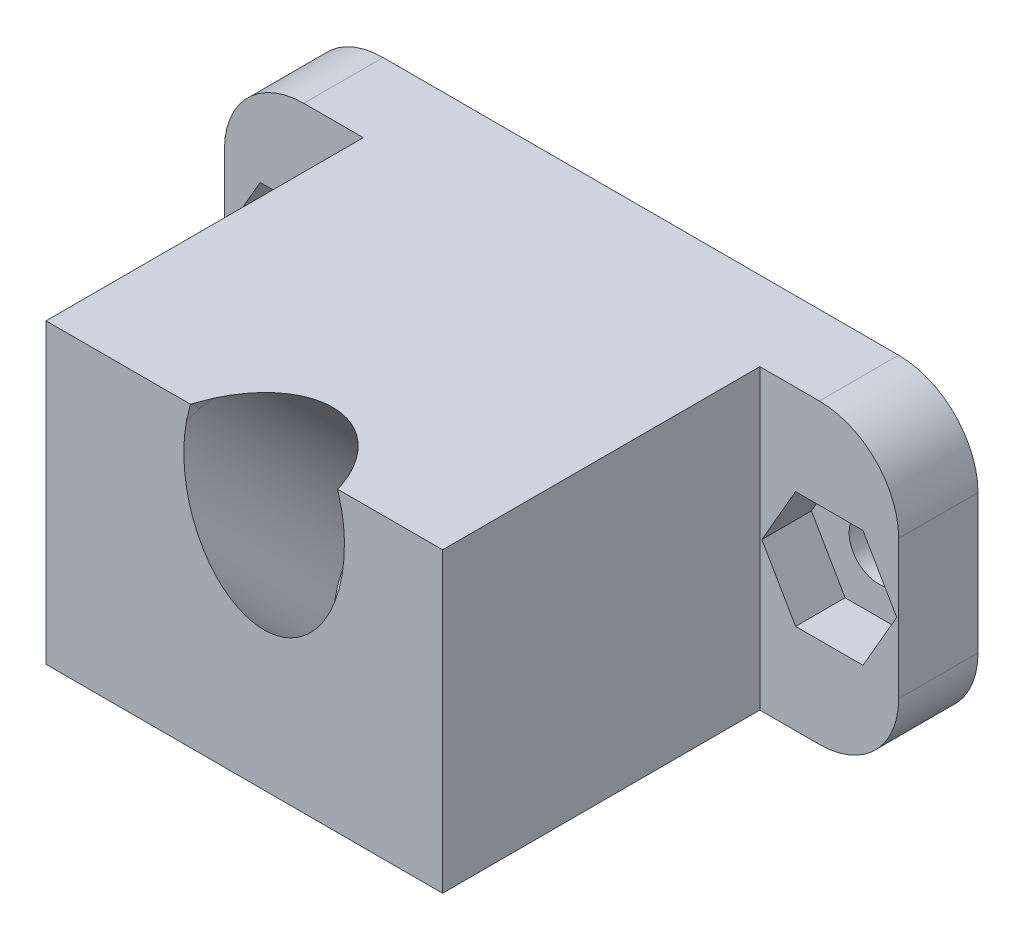
ISO-10303-21;
HEADER;
FILE_DESCRIPTION(('STEP AP214'),'2;1');
FILE_NAME('part.step','',(''),(''),'','','');
FILE_SCHEMA(('AUTOMOTIVE_DESIGN { 1 0 10303 214 1 1 1 1 }'));
ENDSEC;
DATA;
#1=APPLICATION_CONTEXT('core data for automotive mechanical design processes');
#2=APPLICATION_PROTOCOL_DEFINITION('international standard','automotive_design',2000,#1);
#3=PRODUCT_CONTEXT('',#1,'mechanical');
#4=PRODUCT('Part','Part','',(#3));
#5=PRODUCT_RELATED_PRODUCT_CATEGORY('part','',(#4));
#6=PRODUCT_DEFINITION_FORMATION('','',#4);
#7=PRODUCT_DEFINITION_CONTEXT('part definition',#1,'design');
#8=PRODUCT_DEFINITION('design','',#6,#7);
#9=PRODUCT_DEFINITION_SHAPE('','',#8);
#10=(LENGTH_UNIT() NAMED_UNIT(*) SI_UNIT(.MILLI.,.METRE.));
#11=(NAMED_UNIT(*) PLANE_ANGLE_UNIT() SI_UNIT($,.RADIAN.));
#12=(NAMED_UNIT(*) SI_UNIT($,.STERADIAN.) SOLID_ANGLE_UNIT());
#13=UNCERTAINTY_MEASURE_WITH_UNIT(LENGTH_MEASURE(1.E-05),#10,'distance_accuracy_value','');
#14=(GEOMETRIC_REPRESENTATION_CONTEXT(3) GLOBAL_UNCERTAINTY_ASSIGNED_CONTEXT((#13)) GLOBAL_UNIT_ASSIGNED_CONTEXT((#10,
#11,#12)) REPRESENTATION_CONTEXT('',''));
#15=CARTESIAN_POINT('',(0.,0.,0.));
#16=DIRECTION('',(0.,0.,1.));
#17=DIRECTION('',(1.,0.,0.));
#18=AXIS2_PLACEMENT_3D('',#15,#16,#17);
#19=CARTESIAN_POINT('',(0.999999999999999,5.9350288425444,20.7071067811867));
#20=DIRECTION('',(0.,0.707106781186539,0.707106781186556));
#21=DIRECTION('',(0.,-0.707106781186556,0.707106781186539));
#22=AXIS2_PLACEMENT_3D('',#19,#20,#21);
#23=PLANE('',#22);
#24=CARTESIAN_POINT('',(0.999999999999999,5.9350288425444,20.7071067811867));
#25=DIRECTION('',(0.,0.707106781186539,0.707106781186556));
#26=DIRECTION('',(0.,-0.707106781186556,0.707106781186539));
#27=AXIS2_PLACEMENT_3D('',#24,#25,#26);
#28=CIRCLE('',#27,4.05);
#29=CARTESIAN_POINT('',(-2.39178869516723,7.5,19.1421356237311));
#30=VERTEX_POINT('',#29);
#31=CARTESIAN_POINT('',(-2.70814757595359,7.08658030794869,19.5555553157825));
#32=VERTEX_POINT('',#31);
#33=EDGE_CURVE('E258',#30,#32,#28,.T.);
#34=ORIENTED_EDGE('',*,*,#33,.F.);
#35=DIRECTION('',(0.475894672597482,0.621902026284428,-0.621902026284412));
#36=VECTOR('',#35,1.);
#37=CARTESIAN_POINT('',(-2.39178869516723,7.5,19.1421356237311));
#38=LINE('',#37,#36);
#39=EDGE_CURVE('E532',#32,#30,#38,.T.);
#40=ORIENTED_EDGE('',*,*,#39,.F.);
#41=EDGE_LOOP('',(#34,#40));
#42=FACE_BOUND('',#41,.T.);
#43=ADVANCED_FACE('F35',(#42),#23,.F.);
#44=CARTESIAN_POINT('',(-2.92460189063802,6.64213562373112,20.));
#45=VERTEX_POINT('',#44);
#46=EDGE_CURVE('E257',#32,#45,#28,.T.);
#47=ORIENTED_EDGE('',*,*,#46,.F.);
#48=DIRECTION('',(0.32560949439134,0.668572530531368,-0.668572530531354));
#49=VECTOR('',#48,1.);
#50=CARTESIAN_POINT('',(-2.70814757595359,7.08658030794869,19.5555553157825));
#51=LINE('',#50,#49);
#52=EDGE_CURVE('E237',#45,#32,#51,.T.);
#53=ORIENTED_EDGE('',*,*,#52,.F.);
#54=EDGE_LOOP('',(#47,#53));
#55=FACE_BOUND('',#54,.T.);
#56=ADVANCED_FACE('F552',(#55),#23,.F.);
#57=CARTESIAN_POINT('',(4.6436733181703,7.18525777167175,19.4568778520594));
#58=VERTEX_POINT('',#57);
#59=CARTESIAN_POINT('',(4.39178869516723,7.5,19.1421356237311));
#60=VERTEX_POINT('',#59);
#61=EDGE_CURVE('E255',#58,#60,#28,.T.);
#62=ORIENTED_EDGE('',*,*,#61,.F.);
#63=DIRECTION('',(0.492500516136825,-0.615403624300744,0.615403624300727));
#64=VECTOR('',#63,1.);
#65=CARTESIAN_POINT('',(4.6436733181703,7.18525777167176,19.4568778520594));
#66=LINE('',#65,#64);
#67=EDGE_CURVE('E50',#60,#58,#66,.T.);
#68=ORIENTED_EDGE('',*,*,#67,.F.);
#69=EDGE_LOOP('',(#62,#68));
#70=FACE_BOUND('',#69,.T.);
#71=ADVANCED_FACE('F557',(#70),#23,.F.);
#72=CARTESIAN_POINT('',(-11.8,-2.94448637286709,4.));
#73=DIRECTION('',(-0.866025403784439,0.5,0.));
#74=DIRECTION('',(-0.5,-0.866025403784439,0.));
#75=AXIS2_PLACEMENT_3D('',#72,#73,#74);
#76=PLANE('',#75);
#77=DIRECTION('',(0.,0.,-1.));
#78=VECTOR('',#77,1.);
#79=CARTESIAN_POINT('',(-10.1,0.,4.));
#80=LINE('',#79,#78);
#81=CARTESIAN_POINT('',(-10.1,0.,4.));
#82=VERTEX_POINT('',#81);
#83=CARTESIAN_POINT('',(-10.1,0.,1.5));
#84=VERTEX_POINT('',#83);
#85=EDGE_CURVE('E403',#82,#84,#80,.T.);
#86=ORIENTED_EDGE('',*,*,#85,.T.);
#87=DIRECTION('',(-0.500000000000007,-0.866025403784435,0.));
#88=VECTOR('',#87,1.);
#89=CARTESIAN_POINT('',(-10.1,0.,1.5));
#90=LINE('',#89,#88);
#91=CARTESIAN_POINT('',(-11.8,-2.94448637286711,1.5));
#92=VERTEX_POINT('',#91);
#93=EDGE_CURVE('E306',#84,#92,#90,.T.);
#94=ORIENTED_EDGE('',*,*,#93,.T.);
#95=DIRECTION('',(0.,0.,-1.));
#96=VECTOR('',#95,1.);
#97=CARTESIAN_POINT('',(-11.8,-2.94448637286709,4.));
#98=LINE('',#97,#96);
#99=CARTESIAN_POINT('',(-11.8,-2.94448637286709,4.));
#100=VERTEX_POINT('',#99);
#101=EDGE_CURVE('E388',#100,#92,#98,.T.);
#102=ORIENTED_EDGE('',*,*,#101,.F.);
#103=DIRECTION('',(0.5,0.866025403784439,0.));
#104=VECTOR('',#103,1.);
#105=CARTESIAN_POINT('',(-11.8,-2.94448637286709,4.));
#106=LINE('',#105,#104);
#107=EDGE_CURVE('E373',#100,#82,#106,.T.);
#108=ORIENTED_EDGE('',*,*,#107,.T.);
#109=EDGE_LOOP('',(#86,#94,#102,#108));
#110=FACE_BOUND('',#109,.T.);
#111=ADVANCED_FACE('F569',(#110),#76,.T.);
#112=CARTESIAN_POINT('',(-10.1,0.,4.));
#113=DIRECTION('',(-0.866025403784438,-0.500000000000001,0.));
#114=DIRECTION('',(0.500000000000001,-0.866025403784438,0.));
#115=AXIS2_PLACEMENT_3D('',#112,#113,#114);
#116=PLANE('',#115);
#117=DIRECTION('',(0.,0.,-1.));
#118=VECTOR('',#117,1.);
#119=CARTESIAN_POINT('',(-11.8,2.94448637286709,4.));
#120=LINE('',#119,#118);
#121=CARTESIAN_POINT('',(-11.8,2.94448637286709,4.));
#122=VERTEX_POINT('',#121);
#123=CARTESIAN_POINT('',(-11.8,2.94448637286708,1.5));
#124=VERTEX_POINT('',#123);
#125=EDGE_CURVE('E400',#122,#124,#120,.T.);
#126=ORIENTED_EDGE('',*,*,#125,.T.);
#127=DIRECTION('',(0.499999999999995,-0.866025403784441,0.));
#128=VECTOR('',#127,1.);
#129=CARTESIAN_POINT('',(-11.8,2.94448637286708,1.5));
#130=LINE('',#129,#128);
#131=EDGE_CURVE('E303',#124,#84,#130,.T.);
#132=ORIENTED_EDGE('',*,*,#131,.T.);
#133=ORIENTED_EDGE('',*,*,#85,.F.);
#134=DIRECTION('',(-0.500000000000001,0.866025403784438,0.));
#135=VECTOR('',#134,1.);
#136=CARTESIAN_POINT('',(-10.1,0.,4.));
#137=LINE('',#136,#135);
#138=EDGE_CURVE('E377',#82,#122,#137,.T.);
#139=ORIENTED_EDGE('',*,*,#138,.T.);
#140=EDGE_LOOP('',(#126,#132,#133,#139));
#141=FACE_BOUND('',#140,.T.);
#142=ADVANCED_FACE('F573',(#141),#116,.T.);
#143=CARTESIAN_POINT('',(-11.8,2.94448637286709,4.));
#144=DIRECTION('',(0.,-1.,0.));
#145=DIRECTION('',(1.,0.,0.));
#146=AXIS2_PLACEMENT_3D('',#143,#144,#145);
#147=PLANE('',#146);
#148=DIRECTION('',(0.,0.,-1.));
#149=VECTOR('',#148,1.);
#150=CARTESIAN_POINT('',(-15.2,2.94448637286709,4.));
#151=LINE('',#150,#149);
#152=CARTESIAN_POINT('',(-15.2,2.94448637286709,4.));
#153=VERTEX_POINT('',#152);
#154=CARTESIAN_POINT('',(-15.2,2.94448637286709,1.5));
#155=VERTEX_POINT('',#154);
#156=EDGE_CURVE('E397',#153,#155,#151,.T.);
#157=ORIENTED_EDGE('',*,*,#156,.T.);
#158=DIRECTION('',(1.,0.,0.));
#159=VECTOR('',#158,1.);
#160=CARTESIAN_POINT('',(-15.2,2.94448637286709,1.5));
#161=LINE('',#160,#159);
#162=EDGE_CURVE('E300',#155,#124,#161,.T.);
#163=ORIENTED_EDGE('',*,*,#162,.T.);
#164=ORIENTED_EDGE('',*,*,#125,.F.);
#165=DIRECTION('',(-1.,0.,0.));
#166=VECTOR('',#165,1.);
#167=CARTESIAN_POINT('',(-11.8,2.94448637286709,4.));
#168=LINE('',#167,#166);
#169=EDGE_CURVE('E379',#122,#153,#168,.T.);
#170=ORIENTED_EDGE('',*,*,#169,.T.);
#171=EDGE_LOOP('',(#157,#163,#164,#170));
#172=FACE_BOUND('',#171,.T.);
#173=ADVANCED_FACE('F579',(#172),#147,.T.);
#174=CARTESIAN_POINT('',(-15.2,2.94448637286709,4.));
#175=DIRECTION('',(0.866025403784439,-0.5,0.));
#176=DIRECTION('',(0.5,0.866025403784439,0.));
#177=AXIS2_PLACEMENT_3D('',#174,#175,#176);
#178=PLANE('',#177);
#179=DIRECTION('',(0.,0.,-1.));
#180=VECTOR('',#179,1.);
#181=CARTESIAN_POINT('',(-16.9,0.,4.));
#182=LINE('',#181,#180);
#183=CARTESIAN_POINT('',(-16.9,0.,4.));
#184=VERTEX_POINT('',#183);
#185=CARTESIAN_POINT('',(-16.9,0.,1.5));
#186=VERTEX_POINT('',#185);
#187=EDGE_CURVE('E394',#184,#186,#182,.T.);
#188=ORIENTED_EDGE('',*,*,#187,.T.);
#189=DIRECTION('',(0.500000000000001,0.866025403784438,0.));
#190=VECTOR('',#189,1.);
#191=CARTESIAN_POINT('',(-16.9,0.,1.5));
#192=LINE('',#191,#190);
#193=EDGE_CURVE('E297',#186,#155,#192,.T.);
#194=ORIENTED_EDGE('',*,*,#193,.T.);
#195=ORIENTED_EDGE('',*,*,#156,.F.);
#196=DIRECTION('',(-0.5,-0.866025403784439,0.));
#197=VECTOR('',#196,1.);
#198=CARTESIAN_POINT('',(-15.2,2.94448637286709,4.));
#199=LINE('',#198,#197);
#200=EDGE_CURVE('E381',#153,#184,#199,.T.);
#201=ORIENTED_EDGE('',*,*,#200,.T.);
#202=EDGE_LOOP('',(#188,#194,#195,#201));
#203=FACE_BOUND('',#202,.T.);
#204=ADVANCED_FACE('F796',(#203),#178,.T.);
#205=CARTESIAN_POINT('',(-16.9,0.,4.));
#206=DIRECTION('',(0.866025403784439,0.5,0.));
#207=DIRECTION('',(-0.5,0.866025403784439,0.));
#208=AXIS2_PLACEMENT_3D('',#205,#206,#207);
#209=PLANE('',#208);
#210=DIRECTION('',(0.,0.,-1.));
#211=VECTOR('',#210,1.);
#212=CARTESIAN_POINT('',(-15.2,-2.94448637286709,4.));
#213=LINE('',#212,#211);
#214=CARTESIAN_POINT('',(-15.2,-2.94448637286709,4.));
#215=VERTEX_POINT('',#214);
#216=CARTESIAN_POINT('',(-15.2,-2.94448637286709,1.5));
#217=VERTEX_POINT('',#216);
#218=EDGE_CURVE('E391',#215,#217,#213,.T.);
#219=ORIENTED_EDGE('',*,*,#218,.T.);
#220=DIRECTION('',(-0.499999999999995,0.866025403784441,0.));
#221=VECTOR('',#220,1.);
#222=CARTESIAN_POINT('',(-15.2,-2.94448637286707,1.5));
#223=LINE('',#222,#221);
#224=EDGE_CURVE('E289',#217,#186,#223,.T.);
#225=ORIENTED_EDGE('',*,*,#224,.T.);
#226=ORIENTED_EDGE('',*,*,#187,.F.);
#227=DIRECTION('',(0.5,-0.866025403784439,0.));
#228=VECTOR('',#227,1.);
#229=CARTESIAN_POINT('',(-16.9,0.,4.));
#230=LINE('',#229,#228);
#231=EDGE_CURVE('E383',#184,#215,#230,.T.);
#232=ORIENTED_EDGE('',*,*,#231,.T.);
#233=EDGE_LOOP('',(#219,#225,#226,#232));
#234=FACE_BOUND('',#233,.T.);
#235=ADVANCED_FACE('F804',(#234),#209,.T.);
#236=CARTESIAN_POINT('',(-15.2,-2.94448637286709,4.));
#237=DIRECTION('',(0.,1.,0.));
#238=DIRECTION('',(-1.,0.,0.));
#239=AXIS2_PLACEMENT_3D('',#236,#237,#238);
#240=PLANE('',#239);
#241=ORIENTED_EDGE('',*,*,#101,.T.);
#242=DIRECTION('',(-1.,0.,0.));
#243=VECTOR('',#242,1.);
#244=CARTESIAN_POINT('',(-11.8,-2.94448637286711,1.5));
#245=LINE('',#244,#243);
#246=EDGE_CURVE('E309',#92,#217,#245,.T.);
#247=ORIENTED_EDGE('',*,*,#246,.T.);
#248=ORIENTED_EDGE('',*,*,#218,.F.);
#249=DIRECTION('',(1.,0.,0.));
#250=VECTOR('',#249,1.);
#251=CARTESIAN_POINT('',(-15.2,-2.94448637286709,4.));
#252=LINE('',#251,#250);
#253=EDGE_CURVE('E386',#215,#100,#252,.T.);
#254=ORIENTED_EDGE('',*,*,#253,.T.);
#255=EDGE_LOOP('',(#241,#247,#248,#254));
#256=FACE_BOUND('',#255,.T.);
#257=ADVANCED_FACE('F813',(#256),#240,.T.);
#258=CARTESIAN_POINT('',(15.2,-2.94448637286709,4.));
#259=DIRECTION('',(-0.866025403784439,0.5,0.));
#260=DIRECTION('',(-0.5,-0.866025403784439,0.));
#261=AXIS2_PLACEMENT_3D('',#258,#259,#260);
#262=PLANE('',#261);
#263=DIRECTION('',(0.,0.,-1.));
#264=VECTOR('',#263,1.);
#265=CARTESIAN_POINT('',(16.9,0.,4.));
#266=LINE('',#265,#264);
#267=CARTESIAN_POINT('',(16.9,0.,4.));
#268=VERTEX_POINT('',#267);
#269=CARTESIAN_POINT('',(16.9,0.,1.5));
#270=VERTEX_POINT('',#269);
#271=EDGE_CURVE('E358',#268,#270,#266,.T.);
#272=ORIENTED_EDGE('',*,*,#271,.T.);
#273=DIRECTION('',(-0.500000000000006,-0.866025403784435,0.));
#274=VECTOR('',#273,1.);
#275=CARTESIAN_POINT('',(16.9,0.,1.5));
#276=LINE('',#275,#274);
#277=CARTESIAN_POINT('',(15.2,-2.94448637286711,1.5));
#278=VERTEX_POINT('',#277);
#279=EDGE_CURVE('E324',#270,#278,#276,.T.);
#280=ORIENTED_EDGE('',*,*,#279,.T.);
#281=DIRECTION('',(0.,0.,-1.));
#282=VECTOR('',#281,1.);
#283=CARTESIAN_POINT('',(15.2,-2.94448637286709,4.));
#284=LINE('',#283,#282);
#285=CARTESIAN_POINT('',(15.2,-2.94448637286709,4.));
#286=VERTEX_POINT('',#285);
#287=EDGE_CURVE('E343',#286,#278,#284,.T.);
#288=ORIENTED_EDGE('',*,*,#287,.F.);
#289=DIRECTION('',(0.5,0.866025403784439,0.));
#290=VECTOR('',#289,1.);
#291=CARTESIAN_POINT('',(15.2,-2.94448637286709,4.));
#292=LINE('',#291,#290);
#293=EDGE_CURVE('E330',#286,#268,#292,.T.);
#294=ORIENTED_EDGE('',*,*,#293,.T.);
#295=EDGE_LOOP('',(#272,#280,#288,#294));
#296=FACE_BOUND('',#295,.T.);
#297=ADVANCED_FACE('F822',(#296),#262,.T.);
#298=CARTESIAN_POINT('',(16.9,0.,4.));
#299=DIRECTION('',(-0.866025403784438,-0.500000000000001,0.));
#300=DIRECTION('',(0.500000000000001,-0.866025403784438,0.));
#301=AXIS2_PLACEMENT_3D('',#298,#299,#300);
#302=PLANE('',#301);
#303=DIRECTION('',(0.,0.,-1.));
#304=VECTOR('',#303,1.);
#305=CARTESIAN_POINT('',(15.2,2.94448637286709,4.));
#306=LINE('',#305,#304);
#307=CARTESIAN_POINT('',(15.2,2.94448637286709,4.));
#308=VERTEX_POINT('',#307);
#309=CARTESIAN_POINT('',(15.2,2.94448637286709,1.5));
#310=VERTEX_POINT('',#309);
#311=EDGE_CURVE('E355',#308,#310,#306,.T.);
#312=ORIENTED_EDGE('',*,*,#311,.T.);
#313=DIRECTION('',(0.499999999999996,-0.866025403784441,0.));
#314=VECTOR('',#313,1.);
#315=CARTESIAN_POINT('',(15.2,2.94448637286709,1.5));
#316=LINE('',#315,#314);
#317=EDGE_CURVE('E321',#310,#270,#316,.T.);
#318=ORIENTED_EDGE('',*,*,#317,.T.);
#319=ORIENTED_EDGE('',*,*,#271,.F.);
#320=DIRECTION('',(-0.500000000000001,0.866025403784438,0.));
#321=VECTOR('',#320,1.);
#322=CARTESIAN_POINT('',(16.9,0.,4.));
#323=LINE('',#322,#321);
#324=EDGE_CURVE('E332',#268,#308,#323,.T.);
#325=ORIENTED_EDGE('',*,*,#324,.T.);
#326=EDGE_LOOP('',(#312,#318,#319,#325));
#327=FACE_BOUND('',#326,.T.);
#328=ADVANCED_FACE('F831',(#327),#302,.T.);
#329=CARTESIAN_POINT('',(15.2,2.94448637286709,4.));
#330=DIRECTION('',(0.,-1.,0.));
#331=DIRECTION('',(0.,0.,-1.));
#332=AXIS2_PLACEMENT_3D('',#329,#330,#331);
#333=PLANE('',#332);
#334=DIRECTION('',(0.,0.,-1.));
#335=VECTOR('',#334,1.);
#336=CARTESIAN_POINT('',(11.8,2.94448637286709,4.));
#337=LINE('',#336,#335);
#338=CARTESIAN_POINT('',(11.8,2.94448637286709,4.));
#339=VERTEX_POINT('',#338);
#340=CARTESIAN_POINT('',(11.8,2.9444863728671,1.5));
#341=VERTEX_POINT('',#340);
#342=EDGE_CURVE('E352',#339,#341,#337,.T.);
#343=ORIENTED_EDGE('',*,*,#342,.T.);
#344=DIRECTION('',(1.,0.,0.));
#345=VECTOR('',#344,1.);
#346=CARTESIAN_POINT('',(11.8,2.9444863728671,1.5));
#347=LINE('',#346,#345);
#348=EDGE_CURVE('E318',#341,#310,#347,.T.);
#349=ORIENTED_EDGE('',*,*,#348,.T.);
#350=ORIENTED_EDGE('',*,*,#311,.F.);
#351=DIRECTION('',(-1.,0.,0.));
#352=VECTOR('',#351,1.);
#353=CARTESIAN_POINT('',(15.2,2.94448637286709,4.));
#354=LINE('',#353,#352);
#355=EDGE_CURVE('E334',#308,#339,#354,.T.);
#356=ORIENTED_EDGE('',*,*,#355,.T.);
#357=EDGE_LOOP('',(#343,#349,#350,#356));
#358=FACE_BOUND('',#357,.T.);
#359=ADVANCED_FACE('F840',(#358),#333,.T.);
#360=CARTESIAN_POINT('',(11.8,2.94448637286709,4.));
#361=DIRECTION('',(0.866025403784439,-0.5,0.));
#362=DIRECTION('',(0.5,0.866025403784439,0.));
#363=AXIS2_PLACEMENT_3D('',#360,#361,#362);
#364=PLANE('',#363);
#365=DIRECTION('',(0.,0.,-1.));
#366=VECTOR('',#365,1.);
#367=CARTESIAN_POINT('',(10.1,0.,4.));
#368=LINE('',#367,#366);
#369=CARTESIAN_POINT('',(10.1,0.,4.));
#370=VERTEX_POINT('',#369);
#371=CARTESIAN_POINT('',(10.1,0.,1.5));
#372=VERTEX_POINT('',#371);
#373=EDGE_CURVE('E349',#370,#372,#368,.T.);
#374=ORIENTED_EDGE('',*,*,#373,.T.);
#375=DIRECTION('',(0.5,0.866025403784439,0.));
#376=VECTOR('',#375,1.);
#377=CARTESIAN_POINT('',(10.1,0.,1.5));
#378=LINE('',#377,#376);
#379=EDGE_CURVE('E315',#372,#341,#378,.T.);
#380=ORIENTED_EDGE('',*,*,#379,.T.);
#381=ORIENTED_EDGE('',*,*,#342,.F.);
#382=DIRECTION('',(-0.5,-0.866025403784439,0.));
#383=VECTOR('',#382,1.);
#384=CARTESIAN_POINT('',(11.8,2.94448637286709,4.));
#385=LINE('',#384,#383);
#386=EDGE_CURVE('E336',#339,#370,#385,.T.);
#387=ORIENTED_EDGE('',*,*,#386,.T.);
#388=EDGE_LOOP('',(#374,#380,#381,#387));
#389=FACE_BOUND('',#388,.T.);
#390=ADVANCED_FACE('F849',(#389),#364,.T.);
#391=CARTESIAN_POINT('',(10.1,0.,4.));
#392=DIRECTION('',(0.866025403784439,0.5,0.));
#393=DIRECTION('',(-0.5,0.866025403784439,0.));
#394=AXIS2_PLACEMENT_3D('',#391,#392,#393);
#395=PLANE('',#394);
#396=DIRECTION('',(0.,0.,-1.));
#397=VECTOR('',#396,1.);
#398=CARTESIAN_POINT('',(11.8,-2.94448637286709,4.));
#399=LINE('',#398,#397);
#400=CARTESIAN_POINT('',(11.8,-2.94448637286709,4.));
#401=VERTEX_POINT('',#400);
#402=CARTESIAN_POINT('',(11.8,-2.94448637286709,1.5));
#403=VERTEX_POINT('',#402);
#404=EDGE_CURVE('E346',#401,#403,#399,.T.);
#405=ORIENTED_EDGE('',*,*,#404,.T.);
#406=DIRECTION('',(-0.499999999999996,0.866025403784441,0.));
#407=VECTOR('',#406,1.);
#408=CARTESIAN_POINT('',(11.8,-2.94448637286707,1.5));
#409=LINE('',#408,#407);
#410=EDGE_CURVE('E312',#403,#372,#409,.T.);
#411=ORIENTED_EDGE('',*,*,#410,.T.);
#412=ORIENTED_EDGE('',*,*,#373,.F.);
#413=DIRECTION('',(0.5,-0.866025403784439,0.));
#414=VECTOR('',#413,1.);
#415=CARTESIAN_POINT('',(10.1,0.,4.));
#416=LINE('',#415,#414);
#417=EDGE_CURVE('E338',#370,#401,#416,.T.);
#418=ORIENTED_EDGE('',*,*,#417,.T.);
#419=EDGE_LOOP('',(#405,#411,#412,#418));
#420=FACE_BOUND('',#419,.T.);
#421=ADVANCED_FACE('F858',(#420),#395,.T.);
#422=CARTESIAN_POINT('',(11.8,-2.94448637286709,4.));
#423=DIRECTION('',(0.,1.,0.));
#424=DIRECTION('',(-1.,0.,0.));
#425=AXIS2_PLACEMENT_3D('',#422,#423,#424);
#426=PLANE('',#425);
#427=ORIENTED_EDGE('',*,*,#287,.T.);
#428=DIRECTION('',(-1.,0.,0.));
#429=VECTOR('',#428,1.);
#430=CARTESIAN_POINT('',(15.2,-2.94448637286711,1.5));
#431=LINE('',#430,#429);
#432=EDGE_CURVE('E327',#278,#403,#431,.T.);
#433=ORIENTED_EDGE('',*,*,#432,.T.);
#434=ORIENTED_EDGE('',*,*,#404,.F.);
#435=DIRECTION('',(1.,0.,0.));
#436=VECTOR('',#435,1.);
#437=CARTESIAN_POINT('',(11.8,-2.94448637286709,4.));
#438=LINE('',#437,#436);
#439=EDGE_CURVE('E341',#401,#286,#438,.T.);
#440=ORIENTED_EDGE('',*,*,#439,.T.);
#441=EDGE_LOOP('',(#427,#433,#434,#440));
#442=FACE_BOUND('',#441,.T.);
#443=ADVANCED_FACE('F603',(#442),#426,.T.);
#444=CARTESIAN_POINT('',(9.99999999999999,7.5,20.));
#445=DIRECTION('',(-1.,0.,0.));
#446=DIRECTION('',(0.,-1.,0.));
#447=AXIS2_PLACEMENT_3D('',#444,#445,#446);
#448=PLANE('',#447);
#449=DIRECTION('',(0.,-1.,0.));
#450=VECTOR('',#449,1.);
#451=CARTESIAN_POINT('',(9.99999999999999,7.5,4.));
#452=LINE('',#451,#450);
#453=CARTESIAN_POINT('',(9.99999999999999,7.5,4.));
#454=VERTEX_POINT('',#453);
#455=CARTESIAN_POINT('',(9.99999999999999,-7.5,4.));
#456=VERTEX_POINT('',#455);
#457=EDGE_CURVE('E362',#454,#456,#452,.T.);
#458=ORIENTED_EDGE('',*,*,#457,.F.);
#459=DIRECTION('',(0.,0.,-1.));
#460=VECTOR('',#459,1.);
#461=CARTESIAN_POINT('',(9.99999999999999,7.5,20.));
#462=LINE('',#461,#460);
#463=CARTESIAN_POINT('',(9.99999999999999,7.5,20.));
#464=VERTEX_POINT('',#463);
#465=EDGE_CURVE('E439',#464,#454,#462,.T.);
#466=ORIENTED_EDGE('',*,*,#465,.F.);
#467=DIRECTION('',(0.,1.,0.));
#468=VECTOR('',#467,1.);
#469=CARTESIAN_POINT('',(9.99999999999999,7.5,20.));
#470=LINE('',#469,#468);
#471=CARTESIAN_POINT('',(10.,-7.5,20.));
#472=VERTEX_POINT('',#471);
#473=EDGE_CURVE('E419',#472,#464,#470,.T.);
#474=ORIENTED_EDGE('',*,*,#473,.F.);
#475=DIRECTION('',(0.,0.,-1.));
#476=VECTOR('',#475,1.);
#477=CARTESIAN_POINT('',(10.,-7.5,20.));
#478=LINE('',#477,#476);
#479=EDGE_CURVE('E428',#472,#456,#478,.T.);
#480=ORIENTED_EDGE('',*,*,#479,.T.);
#481=EDGE_LOOP('',(#458,#466,#474,#480));
#482=FACE_BOUND('',#481,.T.);
#483=ADVANCED_FACE('F598',(#482),#448,.F.);
#484=CARTESIAN_POINT('',(-10.,7.5,20.));
#485=DIRECTION('',(1.,0.,0.));
#486=DIRECTION('',(0.,0.,-1.));
#487=AXIS2_PLACEMENT_3D('',#484,#485,#486);
#488=PLANE('',#487);
#489=DIRECTION('',(0.,1.,0.));
#490=VECTOR('',#489,1.);
#491=CARTESIAN_POINT('',(-10.,7.5,4.));
#492=LINE('',#491,#490);
#493=CARTESIAN_POINT('',(-10.,-7.5,4.));
#494=VERTEX_POINT('',#493);
#495=CARTESIAN_POINT('',(-10.,7.5,4.));
#496=VERTEX_POINT('',#495);
#497=EDGE_CURVE('E407',#494,#496,#492,.T.);
#498=ORIENTED_EDGE('',*,*,#497,.F.);
#499=DIRECTION('',(0.,0.,-1.));
#500=VECTOR('',#499,1.);
#501=CARTESIAN_POINT('',(-10.,-7.5,20.));
#502=LINE('',#501,#500);
#503=CARTESIAN_POINT('',(-10.,-7.5,20.));
#504=VERTEX_POINT('',#503);
#505=EDGE_CURVE('E434',#504,#494,#502,.T.);
#506=ORIENTED_EDGE('',*,*,#505,.F.);
#507=DIRECTION('',(0.,-1.,0.));
#508=VECTOR('',#507,1.);
#509=CARTESIAN_POINT('',(-10.,7.5,20.));
#510=LINE('',#509,#508);
#511=CARTESIAN_POINT('',(-10.,7.5,20.));
#512=VERTEX_POINT('',#511);
#513=EDGE_CURVE('E424',#512,#504,#510,.T.);
#514=ORIENTED_EDGE('',*,*,#513,.F.);
#515=DIRECTION('',(0.,0.,-1.));
#516=VECTOR('',#515,1.);
#517=CARTESIAN_POINT('',(-10.,7.5,20.));
#518=LINE('',#517,#516);
#519=EDGE_CURVE('E437',#512,#496,#518,.T.);
#520=ORIENTED_EDGE('',*,*,#519,.T.);
#521=EDGE_LOOP('',(#498,#506,#514,#520));
#522=FACE_BOUND('',#521,.T.);
#523=ADVANCED_FACE('F514',(#522),#488,.F.);
#524=CARTESIAN_POINT('',(-10.,7.5,20.));
#525=DIRECTION('',(0.,-1.,0.));
#526=DIRECTION('',(0.,0.,-1.));
#527=AXIS2_PLACEMENT_3D('',#524,#525,#526);
#528=PLANE('',#527);
#529=DIRECTION('',(0.236597168297079,0.,-0.971607832385991));
#530=VECTOR('',#529,1.);
#531=CARTESIAN_POINT('',(-3.12346451019894,7.5,21.6745118455724));
#532=LINE('',#531,#530);
#533=CARTESIAN_POINT('',(-2.7157025019724,7.5,20.));
#534=VERTEX_POINT('',#533);
#535=CARTESIAN_POINT('',(-2.70814757595359,7.5,19.9689750078338));
#536=VERTEX_POINT('',#535);
#537=EDGE_CURVE('E523',#534,#536,#532,.T.);
#538=ORIENTED_EDGE('',*,*,#537,.T.);
#539=DIRECTION('',(0.357348757390985,0.,-0.933971019674122));
#540=VECTOR('',#539,1.);
#541=CARTESIAN_POINT('',(-3.64965822299215,7.5,22.4297185835741));
#542=LINE('',#541,#540);
#543=EDGE_CURVE('E269',#536,#30,#542,.T.);
#544=ORIENTED_EDGE('',*,*,#543,.T.);
#545=CARTESIAN_POINT('',(0.999999999999999,7.5,22.2720779386424));
#546=DIRECTION('',(0.,-1.,0.));
#547=DIRECTION('',(0.,0.,1.));
#548=AXIS2_PLACEMENT_3D('',#545,#546,#547);
#549=ELLIPSE('',#548,5.7275649276111,4.05);
#550=EDGE_CURVE('E274',#30,#60,#549,.T.);
#551=ORIENTED_EDGE('',*,*,#550,.T.);
#552=DIRECTION('',(0.371506174320953,0.,0.928430483365023));
#553=VECTOR('',#552,1.);
#554=CARTESIAN_POINT('',(2.7013721033334,7.5,14.9176182349874));
#555=LINE('',#554,#553);
#556=CARTESIAN_POINT('',(4.6436733181703,7.5,19.7716200803876));
#557=VERTEX_POINT('',#556);
#558=EDGE_CURVE('E267',#60,#557,#555,.T.);
#559=ORIENTED_EDGE('',*,*,#558,.T.);
#560=DIRECTION('',(0.250385598456413,0.,0.968146193550139));
#561=VECTOR('',#560,1.);
#562=CARTESIAN_POINT('',(3.7809798148276,7.5,16.43591133112));
#563=LINE('',#562,#561);
#564=CARTESIAN_POINT('',(4.70273778924763,7.5,20.));
#565=VERTEX_POINT('',#564);
#566=EDGE_CURVE('E246',#557,#565,#563,.T.);
#567=ORIENTED_EDGE('',*,*,#566,.T.);
#568=DIRECTION('',(-1.,0.,0.));
#569=VECTOR('',#568,1.);
#570=CARTESIAN_POINT('',(-10.,7.5,20.));
#571=LINE('',#570,#569);
#572=EDGE_CURVE('E245',#464,#565,#571,.T.);
#573=ORIENTED_EDGE('',*,*,#572,.F.);
#574=ORIENTED_EDGE('',*,*,#465,.T.);
#575=DIRECTION('',(-1.,0.,0.));
#576=VECTOR('',#575,1.);
#577=CARTESIAN_POINT('',(9.99999999999999,7.5,4.));
#578=LINE('',#577,#576);
#579=CARTESIAN_POINT('',(13.,7.5,4.));
#580=VERTEX_POINT('',#579);
#581=EDGE_CURVE('E371',#580,#454,#578,.T.);
#582=ORIENTED_EDGE('',*,*,#581,.F.);
#583=DIRECTION('',(0.,0.,-1.));
#584=VECTOR('',#583,1.);
#585=CARTESIAN_POINT('',(13.,7.5,20.));
#586=LINE('',#585,#584);
#587=CARTESIAN_POINT('',(13.,7.5,0.));
#588=VERTEX_POINT('',#587);
#589=EDGE_CURVE('E444',#580,#588,#586,.T.);
#590=ORIENTED_EDGE('',*,*,#589,.T.);
#591=DIRECTION('',(-1.,0.,0.));
#592=VECTOR('',#591,1.);
#593=CARTESIAN_POINT('',(-10.,7.5,0.));
#594=LINE('',#593,#592);
#595=CARTESIAN_POINT('',(-13.,7.5,0.));
#596=VERTEX_POINT('',#595);
#597=EDGE_CURVE('E417',#588,#596,#594,.T.);
#598=ORIENTED_EDGE('',*,*,#597,.T.);
#599=DIRECTION('',(0.,0.,-1.));
#600=VECTOR('',#599,1.);
#601=CARTESIAN_POINT('',(-13.,7.5,20.));
#602=LINE('',#601,#600);
#603=CARTESIAN_POINT('',(-13.,7.5,4.));
#604=VERTEX_POINT('',#603);
#605=EDGE_CURVE('E442',#596,#604,#602,.F.);
#606=ORIENTED_EDGE('',*,*,#605,.T.);
#607=DIRECTION('',(-1.,0.,0.));
#608=VECTOR('',#607,1.);
#609=CARTESIAN_POINT('',(-10.,7.5,4.));
#610=LINE('',#609,#608);
#611=EDGE_CURVE('E410',#496,#604,#610,.T.);
#612=ORIENTED_EDGE('',*,*,#611,.F.);
#613=ORIENTED_EDGE('',*,*,#519,.F.);
#614=EDGE_CURVE('E421',#534,#512,#571,.T.);
#615=ORIENTED_EDGE('',*,*,#614,.F.);
#616=EDGE_LOOP('',(#538,#544,#551,#559,#567,#573,#574,#582,#590,#598,#606,#612,#613,#615));
#617=FACE_BOUND('',#616,.T.);
#618=ADVANCED_FACE('F279',(#617),#528,.F.);
#619=CARTESIAN_POINT('',(-10.,-7.5,20.));
#620=DIRECTION('',(0.,1.,0.));
#621=DIRECTION('',(0.,0.,1.));
#622=AXIS2_PLACEMENT_3D('',#619,#620,#621);
#623=PLANE('',#622);
#624=DIRECTION('',(1.,0.,0.));
#625=VECTOR('',#624,1.);
#626=CARTESIAN_POINT('',(-10.,-7.5,0.));
#627=LINE('',#626,#625);
#628=CARTESIAN_POINT('',(-13.,-7.5,0.));
#629=VERTEX_POINT('',#628);
#630=CARTESIAN_POINT('',(13.,-7.5,0.));
#631=VERTEX_POINT('',#630);
#632=EDGE_CURVE('E422',#629,#631,#627,.T.);
#633=ORIENTED_EDGE('',*,*,#632,.T.);
#634=DIRECTION('',(0.,0.,-1.));
#635=VECTOR('',#634,1.);
#636=CARTESIAN_POINT('',(13.,-7.5,20.));
#637=LINE('',#636,#635);
#638=CARTESIAN_POINT('',(13.,-7.5,4.));
#639=VERTEX_POINT('',#638);
#640=EDGE_CURVE('E467',#631,#639,#637,.F.);
#641=ORIENTED_EDGE('',*,*,#640,.T.);
#642=DIRECTION('',(1.,0.,0.));
#643=VECTOR('',#642,1.);
#644=CARTESIAN_POINT('',(9.99999999999999,-7.5,4.));
#645=LINE('',#644,#643);
#646=EDGE_CURVE('E365',#456,#639,#645,.T.);
#647=ORIENTED_EDGE('',*,*,#646,.F.);
#648=ORIENTED_EDGE('',*,*,#479,.F.);
#649=DIRECTION('',(1.,0.,0.));
#650=VECTOR('',#649,1.);
#651=CARTESIAN_POINT('',(-10.,-7.5,20.));
#652=LINE('',#651,#650);
#653=EDGE_CURVE('E426',#504,#472,#652,.T.);
#654=ORIENTED_EDGE('',*,*,#653,.F.);
#655=ORIENTED_EDGE('',*,*,#505,.T.);
#656=DIRECTION('',(1.,0.,0.));
#657=VECTOR('',#656,1.);
#658=CARTESIAN_POINT('',(-10.,-7.5,4.));
#659=LINE('',#658,#657);
#660=CARTESIAN_POINT('',(-13.,-7.5,4.));
#661=VERTEX_POINT('',#660);
#662=EDGE_CURVE('E415',#661,#494,#659,.T.);
#663=ORIENTED_EDGE('',*,*,#662,.F.);
#664=DIRECTION('',(0.,0.,-1.));
#665=VECTOR('',#664,1.);
#666=CARTESIAN_POINT('',(-13.,-7.5,20.));
#667=LINE('',#666,#665);
#668=EDGE_CURVE('E464',#661,#629,#667,.T.);
#669=ORIENTED_EDGE('',*,*,#668,.T.);
#670=EDGE_LOOP('',(#633,#641,#647,#648,#654,#655,#663,#669));
#671=FACE_BOUND('',#670,.T.);
#672=ADVANCED_FACE('F506',(#671),#623,.F.);
#673=CARTESIAN_POINT('',(0.,0.,20.));
#674=DIRECTION('',(0.,0.,1.));
#675=DIRECTION('',(1.,0.,0.));
#676=AXIS2_PLACEMENT_3D('',#673,#674,#675);
#677=PLANE('',#676);
#678=DIRECTION('',(-0.236597168297084,-0.971607832385989,0.));
#679=VECTOR('',#678,1.);
#680=CARTESIAN_POINT('',(-4.28777977352042,1.04412142315195,20.));
#681=LINE('',#680,#679);
#682=EDGE_CURVE('E522',#534,#45,#681,.T.);
#683=ORIENTED_EDGE('',*,*,#682,.F.);
#684=ORIENTED_EDGE('',*,*,#614,.T.);
#685=ORIENTED_EDGE('',*,*,#513,.T.);
#686=ORIENTED_EDGE('',*,*,#653,.T.);
#687=ORIENTED_EDGE('',*,*,#473,.T.);
#688=ORIENTED_EDGE('',*,*,#572,.T.);
#689=DIRECTION('',(-0.250385598456418,0.968146193550138,0.));
#690=VECTOR('',#689,1.);
#691=CARTESIAN_POINT('',(6.22598327446151,1.61018713758437,20.));
#692=LINE('',#691,#690);
#693=CARTESIAN_POINT('',(4.92460189063802,6.64213562373113,20.));
#694=VERTEX_POINT('',#693);
#695=EDGE_CURVE('E231',#694,#565,#692,.T.);
#696=ORIENTED_EDGE('',*,*,#695,.F.);
#697=CARTESIAN_POINT('',(0.999999999999999,5.2279220613577,20.));
#698=DIRECTION('',(0.,0.,1.));
#699=DIRECTION('',(0.,1.,0.));
#700=AXIS2_PLACEMENT_3D('',#697,#698,#699);
#701=ELLIPSE('',#700,5.72756492761097,4.05);
#702=EDGE_CURVE('E11',#45,#694,#701,.T.);
#703=ORIENTED_EDGE('',*,*,#702,.F.);
#704=EDGE_LOOP('',(#683,#684,#685,#686,#687,#688,#696,#703));
#705=FACE_BOUND('',#704,.T.);
#706=ADVANCED_FACE('F243',(#705),#677,.T.);
#707=CARTESIAN_POINT('',(0.,0.,0.));
#708=DIRECTION('',(0.,0.,1.));
#709=DIRECTION('',(1.,0.,0.));
#710=AXIS2_PLACEMENT_3D('',#707,#708,#709);
#711=PLANE('',#710);
#712=CARTESIAN_POINT('',(13.5,0.,0.));
#713=DIRECTION('',(0.,0.,-1.));
#714=DIRECTION('',(-1.,0.,0.));
#715=AXIS2_PLACEMENT_3D('',#712,#713,#714);
#716=CIRCLE('',#715,1.5);
#717=CARTESIAN_POINT('',(12.,0.,0.));
#718=VERTEX_POINT('',#717);
#719=EDGE_CURVE('E290',#718,#718,#716,.T.);
#720=ORIENTED_EDGE('',*,*,#719,.F.);
#721=EDGE_LOOP('',(#720));
#722=FACE_BOUND('',#721,.T.);
#723=CARTESIAN_POINT('',(-13.5,0.,0.));
#724=DIRECTION('',(0.,0.,-1.));
#725=DIRECTION('',(-1.,0.,0.));
#726=AXIS2_PLACEMENT_3D('',#723,#724,#725);
#727=CIRCLE('',#726,1.5);
#728=CARTESIAN_POINT('',(-15.,0.,0.));
#729=VERTEX_POINT('',#728);
#730=EDGE_CURVE('E280',#729,#729,#727,.T.);
#731=ORIENTED_EDGE('',*,*,#730,.F.);
#732=EDGE_LOOP('',(#731));
#733=FACE_BOUND('',#732,.T.);
#734=ORIENTED_EDGE('',*,*,#597,.F.);
#735=CARTESIAN_POINT('',(13.,3.5,0.));
#736=DIRECTION('',(0.,0.,1.));
#737=DIRECTION('',(1.,0.,0.));
#738=AXIS2_PLACEMENT_3D('',#735,#736,#737);
#739=CIRCLE('',#738,4.);
#740=CARTESIAN_POINT('',(17.,3.5,0.));
#741=VERTEX_POINT('',#740);
#742=EDGE_CURVE('E453',#588,#741,#739,.F.);
#743=ORIENTED_EDGE('',*,*,#742,.T.);
#744=DIRECTION('',(0.,1.,0.));
#745=VECTOR('',#744,1.);
#746=CARTESIAN_POINT('',(17.,7.5,0.));
#747=LINE('',#746,#745);
#748=CARTESIAN_POINT('',(17.,-3.5,0.));
#749=VERTEX_POINT('',#748);
#750=EDGE_CURVE('E361',#749,#741,#747,.T.);
#751=ORIENTED_EDGE('',*,*,#750,.F.);
#752=CARTESIAN_POINT('',(13.,-3.5,0.));
#753=DIRECTION('',(0.,0.,1.));
#754=DIRECTION('',(1.,0.,0.));
#755=AXIS2_PLACEMENT_3D('',#752,#753,#754);
#756=CIRCLE('',#755,4.);
#757=EDGE_CURVE('E451',#749,#631,#756,.F.);
#758=ORIENTED_EDGE('',*,*,#757,.T.);
#759=ORIENTED_EDGE('',*,*,#632,.F.);
#760=CARTESIAN_POINT('',(-13.,-3.5,0.));
#761=DIRECTION('',(0.,0.,1.));
#762=DIRECTION('',(1.,0.,0.));
#763=AXIS2_PLACEMENT_3D('',#760,#761,#762);
#764=CIRCLE('',#763,4.);
#765=CARTESIAN_POINT('',(-17.,-3.5,0.));
#766=VERTEX_POINT('',#765);
#767=EDGE_CURVE('E447',#629,#766,#764,.F.);
#768=ORIENTED_EDGE('',*,*,#767,.T.);
#769=DIRECTION('',(0.,-1.,0.));
#770=VECTOR('',#769,1.);
#771=CARTESIAN_POINT('',(-17.,7.5,0.));
#772=LINE('',#771,#770);
#773=CARTESIAN_POINT('',(-17.,3.5,0.));
#774=VERTEX_POINT('',#773);
#775=EDGE_CURVE('E406',#774,#766,#772,.T.);
#776=ORIENTED_EDGE('',*,*,#775,.F.);
#777=CARTESIAN_POINT('',(-13.,3.5,0.));
#778=DIRECTION('',(0.,0.,1.));
#779=DIRECTION('',(1.,0.,0.));
#780=AXIS2_PLACEMENT_3D('',#777,#778,#779);
#781=CIRCLE('',#780,4.);
#782=EDGE_CURVE('E449',#774,#596,#781,.F.);
#783=ORIENTED_EDGE('',*,*,#782,.T.);
#784=EDGE_LOOP('',(#734,#743,#751,#758,#759,#768,#776,#783));
#785=FACE_BOUND('',#784,.T.);
#786=ADVANCED_FACE('F488',(#722,#733,#785),#711,.F.);
#787=CARTESIAN_POINT('',(0.,0.,4.));
#788=DIRECTION('',(0.,0.,-1.));
#789=DIRECTION('',(-1.,0.,0.));
#790=AXIS2_PLACEMENT_3D('',#787,#788,#789);
#791=PLANE('',#790);
#792=ORIENTED_EDGE('',*,*,#611,.T.);
#793=CARTESIAN_POINT('',(-13.,3.5,4.));
#794=DIRECTION('',(0.,0.,-1.));
#795=DIRECTION('',(-1.,0.,0.));
#796=AXIS2_PLACEMENT_3D('',#793,#794,#795);
#797=CIRCLE('',#796,4.);
#798=CARTESIAN_POINT('',(-17.,3.5,4.));
#799=VERTEX_POINT('',#798);
#800=EDGE_CURVE('E43',#604,#799,#797,.F.);
#801=ORIENTED_EDGE('',*,*,#800,.T.);
#802=DIRECTION('',(0.,-1.,0.));
#803=VECTOR('',#802,1.);
#804=CARTESIAN_POINT('',(-17.,7.5,4.));
#805=LINE('',#804,#803);
#806=CARTESIAN_POINT('',(-17.,-3.5,4.));
#807=VERTEX_POINT('',#806);
#808=EDGE_CURVE('E413',#799,#807,#805,.T.);
#809=ORIENTED_EDGE('',*,*,#808,.T.);
#810=CARTESIAN_POINT('',(-13.,-3.5,4.));
#811=DIRECTION('',(0.,0.,-1.));
#812=DIRECTION('',(-1.,0.,0.));
#813=AXIS2_PLACEMENT_3D('',#810,#811,#812);
#814=CIRCLE('',#813,4.);
#815=EDGE_CURVE('E473',#807,#661,#814,.F.);
#816=ORIENTED_EDGE('',*,*,#815,.T.);
#817=ORIENTED_EDGE('',*,*,#662,.T.);
#818=ORIENTED_EDGE('',*,*,#497,.T.);
#819=EDGE_LOOP('',(#792,#801,#809,#816,#817,#818));
#820=FACE_BOUND('',#819,.T.);
#821=ORIENTED_EDGE('',*,*,#107,.F.);
#822=ORIENTED_EDGE('',*,*,#253,.F.);
#823=ORIENTED_EDGE('',*,*,#231,.F.);
#824=ORIENTED_EDGE('',*,*,#200,.F.);
#825=ORIENTED_EDGE('',*,*,#169,.F.);
#826=ORIENTED_EDGE('',*,*,#138,.F.);
#827=EDGE_LOOP('',(#821,#822,#823,#824,#825,#826));
#828=FACE_BOUND('',#827,.T.);
#829=ADVANCED_FACE('F476',(#820,#828),#791,.F.);
#830=CARTESIAN_POINT('',(-17.,7.5,4.));
#831=DIRECTION('',(1.,0.,0.));
#832=DIRECTION('',(0.,1.,0.));
#833=AXIS2_PLACEMENT_3D('',#830,#831,#832);
#834=PLANE('',#833);
#835=ORIENTED_EDGE('',*,*,#808,.F.);
#836=DIRECTION('',(0.,0.,-1.));
#837=VECTOR('',#836,1.);
#838=CARTESIAN_POINT('',(-17.,3.5,4.));
#839=LINE('',#838,#837);
#840=EDGE_CURVE('E470',#799,#774,#839,.T.);
#841=ORIENTED_EDGE('',*,*,#840,.T.);
#842=ORIENTED_EDGE('',*,*,#775,.T.);
#843=DIRECTION('',(0.,0.,-1.));
#844=VECTOR('',#843,1.);
#845=CARTESIAN_POINT('',(-17.,-3.5,4.));
#846=LINE('',#845,#844);
#847=EDGE_CURVE('E58',#766,#807,#846,.F.);
#848=ORIENTED_EDGE('',*,*,#847,.T.);
#849=EDGE_LOOP('',(#835,#841,#842,#848));
#850=FACE_BOUND('',#849,.T.);
#851=ADVANCED_FACE('F483',(#850),#834,.F.);
#852=CARTESIAN_POINT('',(0.,0.,4.));
#853=DIRECTION('',(0.,0.,1.));
#854=DIRECTION('',(1.,0.,0.));
#855=AXIS2_PLACEMENT_3D('',#852,#853,#854);
#856=PLANE('',#855);
#857=DIRECTION('',(0.,1.,0.));
#858=VECTOR('',#857,1.);
#859=CARTESIAN_POINT('',(17.,7.5,4.));
#860=LINE('',#859,#858);
#861=CARTESIAN_POINT('',(17.,-3.5,4.));
#862=VERTEX_POINT('',#861);
#863=CARTESIAN_POINT('',(17.,3.5,4.));
#864=VERTEX_POINT('',#863);
#865=EDGE_CURVE('E368',#862,#864,#860,.T.);
#866=ORIENTED_EDGE('',*,*,#865,.T.);
#867=CARTESIAN_POINT('',(13.,3.5,4.));
#868=DIRECTION('',(0.,0.,1.));
#869=DIRECTION('',(1.,0.,0.));
#870=AXIS2_PLACEMENT_3D('',#867,#868,#869);
#871=CIRCLE('',#870,4.);
#872=EDGE_CURVE('E462',#864,#580,#871,.T.);
#873=ORIENTED_EDGE('',*,*,#872,.T.);
#874=ORIENTED_EDGE('',*,*,#581,.T.);
#875=ORIENTED_EDGE('',*,*,#457,.T.);
#876=ORIENTED_EDGE('',*,*,#646,.T.);
#877=CARTESIAN_POINT('',(13.,-3.5,4.));
#878=DIRECTION('',(0.,0.,1.));
#879=DIRECTION('',(1.,0.,0.));
#880=AXIS2_PLACEMENT_3D('',#877,#878,#879);
#881=CIRCLE('',#880,4.);
#882=EDGE_CURVE('E460',#639,#862,#881,.T.);
#883=ORIENTED_EDGE('',*,*,#882,.T.);
#884=EDGE_LOOP('',(#866,#873,#874,#875,#876,#883));
#885=FACE_BOUND('',#884,.T.);
#886=ORIENTED_EDGE('',*,*,#324,.F.);
#887=ORIENTED_EDGE('',*,*,#293,.F.);
#888=ORIENTED_EDGE('',*,*,#439,.F.);
#889=ORIENTED_EDGE('',*,*,#417,.F.);
#890=ORIENTED_EDGE('',*,*,#386,.F.);
#891=ORIENTED_EDGE('',*,*,#355,.F.);
#892=EDGE_LOOP('',(#886,#887,#888,#889,#890,#891));
#893=FACE_BOUND('',#892,.T.);
#894=ADVANCED_FACE('F588',(#885,#893),#856,.T.);
#895=CARTESIAN_POINT('',(17.,7.5,4.));
#896=DIRECTION('',(-1.,0.,0.));
#897=DIRECTION('',(0.,0.,1.));
#898=AXIS2_PLACEMENT_3D('',#895,#896,#897);
#899=PLANE('',#898);
#900=ORIENTED_EDGE('',*,*,#750,.T.);
#901=DIRECTION('',(0.,0.,-1.));
#902=VECTOR('',#901,1.);
#903=CARTESIAN_POINT('',(17.,3.5,4.));
#904=LINE('',#903,#902);
#905=EDGE_CURVE('E458',#741,#864,#904,.F.);
#906=ORIENTED_EDGE('',*,*,#905,.T.);
#907=ORIENTED_EDGE('',*,*,#865,.F.);
#908=DIRECTION('',(0.,0.,-1.));
#909=VECTOR('',#908,1.);
#910=CARTESIAN_POINT('',(17.,-3.5,4.));
#911=LINE('',#910,#909);
#912=EDGE_CURVE('E455',#862,#749,#911,.T.);
#913=ORIENTED_EDGE('',*,*,#912,.T.);
#914=EDGE_LOOP('',(#900,#906,#907,#913));
#915=FACE_BOUND('',#914,.T.);
#916=ADVANCED_FACE('F497',(#915),#899,.F.);
#917=CARTESIAN_POINT('',(0.,0.,1.5));
#918=DIRECTION('',(0.,0.,-1.));
#919=DIRECTION('',(-1.,0.,0.));
#920=AXIS2_PLACEMENT_3D('',#917,#918,#919);
#921=PLANE('',#920);
#922=CARTESIAN_POINT('',(13.5,0.,1.5));
#923=DIRECTION('',(0.,0.,-1.));
#924=DIRECTION('',(-1.,0.,0.));
#925=AXIS2_PLACEMENT_3D('',#922,#923,#924);
#926=CIRCLE('',#925,1.5);
#927=CARTESIAN_POINT('',(12.,0.,1.5));
#928=VERTEX_POINT('',#927);
#929=EDGE_CURVE('E286',#928,#928,#926,.T.);
#930=ORIENTED_EDGE('',*,*,#929,.T.);
#931=EDGE_LOOP('',(#930));
#932=FACE_BOUND('',#931,.T.);
#933=ORIENTED_EDGE('',*,*,#410,.F.);
#934=ORIENTED_EDGE('',*,*,#432,.F.);
#935=ORIENTED_EDGE('',*,*,#279,.F.);
#936=ORIENTED_EDGE('',*,*,#317,.F.);
#937=ORIENTED_EDGE('',*,*,#348,.F.);
#938=ORIENTED_EDGE('',*,*,#379,.F.);
#939=EDGE_LOOP('',(#933,#934,#935,#936,#937,#938));
#940=FACE_BOUND('',#939,.T.);
#941=ADVANCED_FACE('F713',(#932,#940),#921,.F.);
#942=CARTESIAN_POINT('',(0.,0.,1.5));
#943=DIRECTION('',(0.,0.,-1.));
#944=DIRECTION('',(-1.,0.,0.));
#945=AXIS2_PLACEMENT_3D('',#942,#943,#944);
#946=PLANE('',#945);
#947=CARTESIAN_POINT('',(-13.5,0.,1.5));
#948=DIRECTION('',(0.,0.,-1.));
#949=DIRECTION('',(-1.,0.,0.));
#950=AXIS2_PLACEMENT_3D('',#947,#948,#949);
#951=CIRCLE('',#950,1.5);
#952=CARTESIAN_POINT('',(-15.,0.,1.5));
#953=VERTEX_POINT('',#952);
#954=EDGE_CURVE('E282',#953,#953,#951,.T.);
#955=ORIENTED_EDGE('',*,*,#954,.T.);
#956=EDGE_LOOP('',(#955));
#957=FACE_BOUND('',#956,.T.);
#958=ORIENTED_EDGE('',*,*,#224,.F.);
#959=ORIENTED_EDGE('',*,*,#246,.F.);
#960=ORIENTED_EDGE('',*,*,#93,.F.);
#961=ORIENTED_EDGE('',*,*,#131,.F.);
#962=ORIENTED_EDGE('',*,*,#162,.F.);
#963=ORIENTED_EDGE('',*,*,#193,.F.);
#964=EDGE_LOOP('',(#958,#959,#960,#961,#962,#963));
#965=FACE_BOUND('',#964,.T.);
#966=ADVANCED_FACE('F721',(#957,#965),#946,.F.);
#967=CARTESIAN_POINT('',(-13.5,0.,1.5));
#968=DIRECTION('',(0.,0.,-1.));
#969=DIRECTION('',(-1.,0.,0.));
#970=AXIS2_PLACEMENT_3D('',#967,#968,#969);
#971=CYLINDRICAL_SURFACE('',#970,1.5);
#972=ORIENTED_EDGE('',*,*,#954,.F.);
#973=EDGE_LOOP('',(#972));
#974=FACE_BOUND('',#973,.T.);
#975=ORIENTED_EDGE('',*,*,#730,.T.);
#976=EDGE_LOOP('',(#975));
#977=FACE_BOUND('',#976,.T.);
#978=ADVANCED_FACE('F730',(#974,#977),#971,.F.);
#979=CARTESIAN_POINT('',(13.5,0.,1.5));
#980=DIRECTION('',(0.,0.,-1.));
#981=DIRECTION('',(-1.,0.,0.));
#982=AXIS2_PLACEMENT_3D('',#979,#980,#981);
#983=CYLINDRICAL_SURFACE('',#982,1.5);
#984=ORIENTED_EDGE('',*,*,#929,.F.);
#985=EDGE_LOOP('',(#984));
#986=FACE_BOUND('',#985,.T.);
#987=ORIENTED_EDGE('',*,*,#719,.T.);
#988=EDGE_LOOP('',(#987));
#989=FACE_BOUND('',#988,.T.);
#990=ADVANCED_FACE('F607',(#986,#989),#983,.F.);
#991=CARTESIAN_POINT('',(13.,3.5,20.));
#992=DIRECTION('',(0.,0.,-1.));
#993=DIRECTION('',(-1.,0.,0.));
#994=AXIS2_PLACEMENT_3D('',#991,#992,#993);
#995=CYLINDRICAL_SURFACE('',#994,4.);
#996=ORIENTED_EDGE('',*,*,#872,.F.);
#997=ORIENTED_EDGE('',*,*,#905,.F.);
#998=ORIENTED_EDGE('',*,*,#742,.F.);
#999=ORIENTED_EDGE('',*,*,#589,.F.);
#1000=EDGE_LOOP('',(#996,#997,#998,#999));
#1001=FACE_BOUND('',#1000,.T.);
#1002=ADVANCED_FACE('F493',(#1001),#995,.T.);
#1003=CARTESIAN_POINT('',(13.,-3.5,4.));
#1004=DIRECTION('',(0.,0.,-1.));
#1005=DIRECTION('',(-1.,0.,0.));
#1006=AXIS2_PLACEMENT_3D('',#1003,#1004,#1005);
#1007=CYLINDRICAL_SURFACE('',#1006,4.);
#1008=ORIENTED_EDGE('',*,*,#882,.F.);
#1009=ORIENTED_EDGE('',*,*,#640,.F.);
#1010=ORIENTED_EDGE('',*,*,#757,.F.);
#1011=ORIENTED_EDGE('',*,*,#912,.F.);
#1012=EDGE_LOOP('',(#1008,#1009,#1010,#1011));
#1013=FACE_BOUND('',#1012,.T.);
#1014=ADVANCED_FACE('F502',(#1013),#1007,.T.);
#1015=CARTESIAN_POINT('',(-13.,3.5,4.));
#1016=DIRECTION('',(0.,0.,-1.));
#1017=DIRECTION('',(-1.,0.,0.));
#1018=AXIS2_PLACEMENT_3D('',#1015,#1016,#1017);
#1019=CYLINDRICAL_SURFACE('',#1018,4.);
#1020=ORIENTED_EDGE('',*,*,#800,.F.);
#1021=ORIENTED_EDGE('',*,*,#605,.F.);
#1022=ORIENTED_EDGE('',*,*,#782,.F.);
#1023=ORIENTED_EDGE('',*,*,#840,.F.);
#1024=EDGE_LOOP('',(#1020,#1021,#1022,#1023));
#1025=FACE_BOUND('',#1024,.T.);
#1026=ADVANCED_FACE('F485',(#1025),#1019,.T.);
#1027=CARTESIAN_POINT('',(-13.,-3.5,20.));
#1028=DIRECTION('',(0.,0.,-1.));
#1029=DIRECTION('',(-1.,0.,0.));
#1030=AXIS2_PLACEMENT_3D('',#1027,#1028,#1029);
#1031=CYLINDRICAL_SURFACE('',#1030,4.);
#1032=ORIENTED_EDGE('',*,*,#815,.F.);
#1033=ORIENTED_EDGE('',*,*,#847,.F.);
#1034=ORIENTED_EDGE('',*,*,#767,.F.);
#1035=ORIENTED_EDGE('',*,*,#668,.F.);
#1036=EDGE_LOOP('',(#1032,#1033,#1034,#1035));
#1037=FACE_BOUND('',#1036,.T.);
#1038=ADVANCED_FACE('F37',(#1037),#1031,.T.);
#1039=CARTESIAN_POINT('',(0.999999999999999,-3.25735931288061,11.5147186257615));
#1040=DIRECTION('',(0.,0.707106781186539,0.707106781186556));
#1041=DIRECTION('',(0.,-0.707106781186556,0.707106781186539));
#1042=AXIS2_PLACEMENT_3D('',#1039,#1040,#1041);
#1043=CYLINDRICAL_SURFACE('',#1042,4.05);
#1044=CARTESIAN_POINT('',(0.999999999999999,-3.25735931288061,11.5147186257615));
#1045=DIRECTION('',(0.,0.707106781186539,0.707106781186556));
#1046=DIRECTION('',(0.,-0.707106781186556,0.707106781186539));
#1047=AXIS2_PLACEMENT_3D('',#1044,#1045,#1046);
#1048=CIRCLE('',#1047,4.05);
#1049=CARTESIAN_POINT('',(0.999999999999999,-6.12114177668616,14.378501089567));
#1050=VERTEX_POINT('',#1049);
#1051=EDGE_CURVE('E254',#1050,#1050,#1048,.T.);
#1052=ORIENTED_EDGE('',*,*,#1051,.F.);
#1053=EDGE_LOOP('',(#1052));
#1054=FACE_BOUND('',#1053,.T.);
#1055=ORIENTED_EDGE('',*,*,#33,.T.);
#1056=ORIENTED_EDGE('',*,*,#46,.T.);
#1057=ORIENTED_EDGE('',*,*,#702,.T.);
#1058=EDGE_CURVE('E250',#694,#58,#28,.T.);
#1059=ORIENTED_EDGE('',*,*,#1058,.T.);
#1060=ORIENTED_EDGE('',*,*,#61,.T.);
#1061=ORIENTED_EDGE('',*,*,#550,.F.);
#1062=EDGE_LOOP('',(#1055,#1056,#1057,#1059,#1060,#1061));
#1063=FACE_BOUND('',#1062,.T.);
#1064=ADVANCED_FACE('F261',(#1054,#1063),#1043,.F.);
#1065=ORIENTED_EDGE('',*,*,#1058,.F.);
#1066=DIRECTION('',(0.34349501940789,-0.664082514316554,0.66408251431654));
#1067=VECTOR('',#1066,1.);
#1068=CARTESIAN_POINT('',(4.92460189063802,6.64213562373113,20.));
#1069=LINE('',#1068,#1067);
#1070=EDGE_CURVE('E228',#58,#694,#1069,.T.);
#1071=ORIENTED_EDGE('',*,*,#1070,.F.);
#1072=EDGE_LOOP('',(#1065,#1071));
#1073=FACE_BOUND('',#1072,.T.);
#1074=ADVANCED_FACE('F251',(#1073),#23,.F.);
#1075=CARTESIAN_POINT('',(0.999999999999999,-3.25735931288061,11.5147186257615));
#1076=DIRECTION('',(0.,0.707106781186539,0.707106781186556));
#1077=DIRECTION('',(0.,-0.707106781186556,0.707106781186539));
#1078=AXIS2_PLACEMENT_3D('',#1075,#1076,#1077);
#1079=PLANE('',#1078);
#1080=ORIENTED_EDGE('',*,*,#1051,.T.);
#1081=EDGE_LOOP('',(#1080));
#1082=FACE_BOUND('',#1081,.T.);
#1083=ADVANCED_FACE('F561',(#1082),#1079,.T.);
#1084=CARTESIAN_POINT('',(4.92460189063802,13.7132034355965,27.0710678118656));
#1085=DIRECTION('',(0.939154498281286,0.242887657527126,-0.242887657527121));
#1086=DIRECTION('',(-0.250385598456418,0.968146193550138,0.));
#1087=AXIS2_PLACEMENT_3D('',#1084,#1085,#1086);
#1088=PLANE('',#1087);
#1089=DIRECTION('',(0.,-0.707106781186539,-0.707106781186556));
#1090=VECTOR('',#1089,1.);
#1091=CARTESIAN_POINT('',(4.6436733181703,14.2563255835371,26.5279456639249));
#1092=LINE('',#1091,#1090);
#1093=EDGE_CURVE('E233',#557,#58,#1092,.T.);
#1094=ORIENTED_EDGE('',*,*,#1093,.T.);
#1095=ORIENTED_EDGE('',*,*,#1070,.T.);
#1096=ORIENTED_EDGE('',*,*,#695,.T.);
#1097=ORIENTED_EDGE('',*,*,#566,.F.);
#1098=EDGE_LOOP('',(#1094,#1095,#1096,#1097));
#1099=FACE_BOUND('',#1098,.T.);
#1100=ADVANCED_FACE('F230',(#1099),#1088,.F.);
#1101=CARTESIAN_POINT('',(4.6436733181703,14.2563255835371,26.5279456639249));
#1102=DIRECTION('',(0.870312151819657,0.348250454698228,-0.348250454698219));
#1103=DIRECTION('',(-0.37150617432096,0.92843048336502,0.));
#1104=AXIS2_PLACEMENT_3D('',#1101,#1102,#1103);
#1105=PLANE('',#1104);
#1106=ORIENTED_EDGE('',*,*,#67,.T.);
#1107=ORIENTED_EDGE('',*,*,#1093,.F.);
#1108=ORIENTED_EDGE('',*,*,#558,.F.);
#1109=EDGE_LOOP('',(#1106,#1107,#1108));
#1110=FACE_BOUND('',#1109,.T.);
#1111=ADVANCED_FACE('F543',(#1110),#1105,.F.);
#1112=CARTESIAN_POINT('',(-2.39178869516723,14.5710678118654,26.2132034355967));
#1113=DIRECTION('',(-0.879502280038736,0.336508350124235,-0.336508350124227));
#1114=DIRECTION('',(-0.357348757390993,-0.933971019674119,0.));
#1115=AXIS2_PLACEMENT_3D('',#1112,#1113,#1114);
#1116=PLANE('',#1115);
#1117=DIRECTION('',(0.,-0.707106781186539,-0.707106781186556));
#1118=VECTOR('',#1117,1.);
#1119=CARTESIAN_POINT('',(-2.70814757595359,14.1576481198141,26.626623127648));
#1120=LINE('',#1119,#1118);
#1121=EDGE_CURVE('E247',#536,#32,#1120,.T.);
#1122=ORIENTED_EDGE('',*,*,#1121,.T.);
#1123=ORIENTED_EDGE('',*,*,#39,.T.);
#1124=ORIENTED_EDGE('',*,*,#543,.F.);
#1125=EDGE_LOOP('',(#1122,#1123,#1124));
#1126=FACE_BOUND('',#1125,.T.);
#1127=ADVANCED_FACE('F541',(#1126),#1116,.F.);
#1128=CARTESIAN_POINT('',(-2.70814757595359,14.1576481198141,26.626623127648));
#1129=DIRECTION('',(-0.945504340107551,0.230240681502843,-0.230240681502837));
#1130=DIRECTION('',(-0.236597168297084,-0.971607832385989,0.));
#1131=AXIS2_PLACEMENT_3D('',#1128,#1129,#1130);
#1132=PLANE('',#1131);
#1133=ORIENTED_EDGE('',*,*,#682,.T.);
#1134=ORIENTED_EDGE('',*,*,#52,.T.);
#1135=ORIENTED_EDGE('',*,*,#1121,.F.);
#1136=ORIENTED_EDGE('',*,*,#537,.F.);
#1137=EDGE_LOOP('',(#1133,#1134,#1135,#1136));
#1138=FACE_BOUND('',#1137,.T.);
#1139=ADVANCED_FACE('F538',(#1138),#1132,.F.);
#1140=CLOSED_SHELL('',(#43,#56,#71,#111,#142,#173,#204,#235,#257,#297,#328,#359,#390,#421,#443,
#483,#523,#618,#672,#706,#786,#829,#851,#894,#916,#941,#966,#978,#990,#1002,#1014,#1026,#1038,
#1064,#1074,#1083,#1100,#1111,#1127,#1139));
#1141=MANIFOLD_SOLID_BREP('B2',#1140);
#1142=ADVANCED_BREP_SHAPE_REPRESENTATION('',(#18,#1141),#14);
#1143=SHAPE_DEFINITION_REPRESENTATION(#9,#1142);
ENDSEC;
END-ISO-10303-21;
